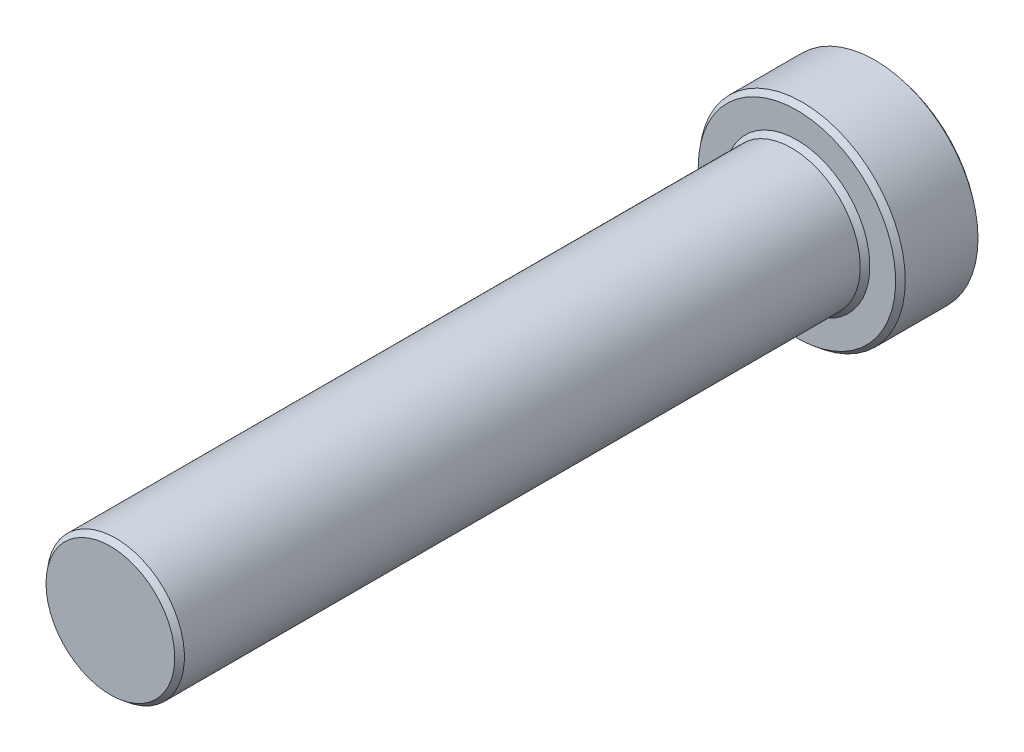
ISO-10303-21;
HEADER;
FILE_DESCRIPTION(('STEP AP214'),'2;1');
FILE_NAME('part.step','',(''),(''),'','','');
FILE_SCHEMA(('AUTOMOTIVE_DESIGN { 1 0 10303 214 1 1 1 1 }'));
ENDSEC;
DATA;
#1=APPLICATION_CONTEXT('core data for automotive mechanical design processes');
#2=APPLICATION_PROTOCOL_DEFINITION('international standard','automotive_design',2000,#1);
#3=PRODUCT_CONTEXT('',#1,'mechanical');
#4=PRODUCT('Part','Part','',(#3));
#5=PRODUCT_RELATED_PRODUCT_CATEGORY('part','',(#4));
#6=PRODUCT_DEFINITION_FORMATION('','',#4);
#7=PRODUCT_DEFINITION_CONTEXT('part definition',#1,'design');
#8=PRODUCT_DEFINITION('design','',#6,#7);
#9=PRODUCT_DEFINITION_SHAPE('','',#8);
#10=(LENGTH_UNIT() NAMED_UNIT(*) SI_UNIT(.MILLI.,.METRE.));
#11=(NAMED_UNIT(*) PLANE_ANGLE_UNIT() SI_UNIT($,.RADIAN.));
#12=(NAMED_UNIT(*) SI_UNIT($,.STERADIAN.) SOLID_ANGLE_UNIT());
#13=UNCERTAINTY_MEASURE_WITH_UNIT(LENGTH_MEASURE(1.E-05),#10,'distance_accuracy_value','');
#14=(GEOMETRIC_REPRESENTATION_CONTEXT(3) GLOBAL_UNCERTAINTY_ASSIGNED_CONTEXT((#13)) GLOBAL_UNIT_ASSIGNED_CONTEXT((#10,
#11,#12)) REPRESENTATION_CONTEXT('',''));
#15=CARTESIAN_POINT('',(0.,0.,0.));
#16=DIRECTION('',(0.,0.,1.));
#17=DIRECTION('',(1.,0.,0.));
#18=AXIS2_PLACEMENT_3D('',#15,#16,#17);
#19=CARTESIAN_POINT('',(0.,0.,-22.0783093017638));
#20=DIRECTION('',(0.,0.,-1.));
#21=DIRECTION('',(-1.,0.,0.));
#22=AXIS2_PLACEMENT_3D('',#19,#20,#21);
#23=CONICAL_SURFACE('',#22,10.6246950475544,0.674740942223556);
#24=CARTESIAN_POINT('',(0.,0.,-21.2974404923208));
#25=DIRECTION('',(0.,0.,-1.));
#26=DIRECTION('',(-1.,0.,0.));
#27=AXIS2_PLACEMENT_3D('',#24,#25,#26);
#28=CIRCLE('',#27,10.);
#29=CARTESIAN_POINT('',(-10.,0.,-21.2974404923208));
#30=VERTEX_POINT('',#29);
#31=EDGE_CURVE('E59',#30,#30,#28,.T.);
#32=ORIENTED_EDGE('',*,*,#31,.T.);
#33=EDGE_LOOP('',(#32));
#34=FACE_BOUND('',#33,.T.);
#35=CARTESIAN_POINT('',(0.,0.,-22.0783093017638));
#36=DIRECTION('',(0.,0.,-1.));
#37=DIRECTION('',(-1.,0.,0.));
#38=AXIS2_PLACEMENT_3D('',#35,#36,#37);
#39=CIRCLE('',#38,10.6246950475544);
#40=CARTESIAN_POINT('',(-10.6246950475544,0.,-22.0783093017638));
#41=VERTEX_POINT('',#40);
#42=EDGE_CURVE('E10',#41,#41,#39,.T.);
#43=ORIENTED_EDGE('',*,*,#42,.F.);
#44=EDGE_LOOP('',(#43));
#45=FACE_BOUND('',#44,.T.);
#46=ADVANCED_FACE('F31',(#34,#45),#23,.T.);
#47=CARTESIAN_POINT('',(-10.6246950475544,0.,-22.0783093017638));
#48=DIRECTION('',(0.,0.,1.));
#49=DIRECTION('',(1.,0.,0.));
#50=AXIS2_PLACEMENT_3D('',#47,#48,#49);
#51=PLANE('',#50);
#52=ORIENTED_EDGE('',*,*,#42,.T.);
#53=EDGE_LOOP('',(#52));
#54=FACE_BOUND('',#53,.T.);
#55=CARTESIAN_POINT('',(0.,0.,-22.0783093017638));
#56=DIRECTION('',(0.,0.,-1.));
#57=DIRECTION('',(-1.,0.,0.));
#58=AXIS2_PLACEMENT_3D('',#55,#56,#57);
#59=CIRCLE('',#58,14.3753049524456);
#60=CARTESIAN_POINT('',(-14.3753049524456,0.,-22.0783093017638));
#61=VERTEX_POINT('',#60);
#62=EDGE_CURVE('E37',#61,#61,#59,.T.);
#63=ORIENTED_EDGE('',*,*,#62,.F.);
#64=EDGE_LOOP('',(#63));
#65=FACE_BOUND('',#64,.T.);
#66=ADVANCED_FACE('F77',(#54,#65),#51,.T.);
#67=CARTESIAN_POINT('',(0.,0.,-22.8591781112069));
#68=DIRECTION('',(0.,0.,-1.));
#69=DIRECTION('',(-1.,0.,0.));
#70=AXIS2_PLACEMENT_3D('',#67,#68,#69);
#71=CONICAL_SURFACE('',#70,15.,0.67474094222355);
#72=ORIENTED_EDGE('',*,*,#62,.T.);
#73=EDGE_LOOP('',(#72));
#74=FACE_BOUND('',#73,.T.);
#75=CARTESIAN_POINT('',(0.,0.,-22.8591781112069));
#76=DIRECTION('',(0.,0.,-1.));
#77=DIRECTION('',(-1.,0.,0.));
#78=AXIS2_PLACEMENT_3D('',#75,#76,#77);
#79=CIRCLE('',#78,15.);
#80=CARTESIAN_POINT('',(-15.,0.,-22.8591781112069));
#81=VERTEX_POINT('',#80);
#82=EDGE_CURVE('E41',#81,#81,#79,.T.);
#83=ORIENTED_EDGE('',*,*,#82,.F.);
#84=EDGE_LOOP('',(#83));
#85=FACE_BOUND('',#84,.T.);
#86=ADVANCED_FACE('F81',(#74,#85),#71,.T.);
#87=CARTESIAN_POINT('',(0.,0.,-35.8446601941748));
#88=DIRECTION('',(0.,0.,-1.));
#89=DIRECTION('',(-1.,0.,0.));
#90=AXIS2_PLACEMENT_3D('',#87,#88,#89);
#91=CYLINDRICAL_SURFACE('',#90,15.);
#92=ORIENTED_EDGE('',*,*,#82,.T.);
#93=EDGE_LOOP('',(#92));
#94=FACE_BOUND('',#93,.T.);
#95=CARTESIAN_POINT('',(0.,0.,-33.4536142542094));
#96=DIRECTION('',(0.,0.,-1.));
#97=DIRECTION('',(-1.,0.,0.));
#98=AXIS2_PLACEMENT_3D('',#95,#96,#97);
#99=CIRCLE('',#98,15.);
#100=CARTESIAN_POINT('',(-15.,0.,-33.4536142542094));
#101=VERTEX_POINT('',#100);
#102=EDGE_CURVE('E45',#101,#101,#99,.T.);
#103=ORIENTED_EDGE('',*,*,#102,.F.);
#104=EDGE_LOOP('',(#103));
#105=FACE_BOUND('',#104,.T.);
#106=ADVANCED_FACE('F85',(#94,#105),#91,.T.);
#107=CARTESIAN_POINT('',(0.,0.,-34.0783093017638));
#108=DIRECTION('',(0.,0.,1.));
#109=DIRECTION('',(1.,0.,0.));
#110=AXIS2_PLACEMENT_3D('',#107,#108,#109);
#111=CONICAL_SURFACE('',#110,14.219131190557,0.896055384571347);
#112=ORIENTED_EDGE('',*,*,#102,.T.);
#113=EDGE_LOOP('',(#112));
#114=FACE_BOUND('',#113,.T.);
#115=CARTESIAN_POINT('',(0.,0.,-34.0783093017638));
#116=DIRECTION('',(0.,0.,-1.));
#117=DIRECTION('',(-1.,0.,0.));
#118=AXIS2_PLACEMENT_3D('',#115,#116,#117);
#119=CIRCLE('',#118,14.219131190557);
#120=CARTESIAN_POINT('',(-14.219131190557,0.,-34.0783093017638));
#121=VERTEX_POINT('',#120);
#122=EDGE_CURVE('E50',#121,#121,#119,.T.);
#123=ORIENTED_EDGE('',*,*,#122,.F.);
#124=EDGE_LOOP('',(#123));
#125=FACE_BOUND('',#124,.T.);
#126=ADVANCED_FACE('F91',(#114,#125),#111,.T.);
#127=CARTESIAN_POINT('',(-14.219131190557,0.,-34.0783093017638));
#128=DIRECTION('',(0.,0.,-1.));
#129=DIRECTION('',(-1.,0.,0.));
#130=AXIS2_PLACEMENT_3D('',#127,#128,#129);
#131=PLANE('',#130);
#132=ORIENTED_EDGE('',*,*,#122,.T.);
#133=EDGE_LOOP('',(#132));
#134=FACE_BOUND('',#133,.T.);
#135=ADVANCED_FACE('F95',(#134),#131,.T.);
#136=CARTESIAN_POINT('',(-9.37530495244557,0.,77.9216906982362));
#137=DIRECTION('',(0.,0.,1.));
#138=DIRECTION('',(1.,0.,0.));
#139=AXIS2_PLACEMENT_3D('',#136,#137,#138);
#140=PLANE('',#139);
#141=CARTESIAN_POINT('',(0.,0.,77.9216906982362));
#142=DIRECTION('',(0.,0.,-1.));
#143=DIRECTION('',(-1.,0.,0.));
#144=AXIS2_PLACEMENT_3D('',#141,#142,#143);
#145=CIRCLE('',#144,9.37530495244557);
#146=CARTESIAN_POINT('',(-9.37530495244557,0.,77.9216906982362));
#147=VERTEX_POINT('',#146);
#148=EDGE_CURVE('E53',#147,#147,#145,.T.);
#149=ORIENTED_EDGE('',*,*,#148,.F.);
#150=EDGE_LOOP('',(#149));
#151=FACE_BOUND('',#150,.T.);
#152=ADVANCED_FACE('F73',(#151),#140,.T.);
#153=CARTESIAN_POINT('',(0.,0.,77.1408218887932));
#154=DIRECTION('',(0.,0.,-1.));
#155=DIRECTION('',(-1.,0.,0.));
#156=AXIS2_PLACEMENT_3D('',#153,#154,#155);
#157=CONICAL_SURFACE('',#156,9.99999999999999,0.674740942223544);
#158=ORIENTED_EDGE('',*,*,#148,.T.);
#159=EDGE_LOOP('',(#158));
#160=FACE_BOUND('',#159,.T.);
#161=CARTESIAN_POINT('',(0.,0.,77.1408218887932));
#162=DIRECTION('',(0.,0.,-1.));
#163=DIRECTION('',(-1.,0.,0.));
#164=AXIS2_PLACEMENT_3D('',#161,#162,#163);
#165=CIRCLE('',#164,9.99999999999999);
#166=CARTESIAN_POINT('',(-9.99999999999999,0.,77.1408218887932));
#167=VERTEX_POINT('',#166);
#168=EDGE_CURVE('E56',#167,#167,#165,.T.);
#169=ORIENTED_EDGE('',*,*,#168,.F.);
#170=EDGE_LOOP('',(#169));
#171=FACE_BOUND('',#170,.T.);
#172=ADVANCED_FACE('F67',(#160,#171),#157,.T.);
#173=CARTESIAN_POINT('',(0.,0.,-35.8446601941748));
#174=DIRECTION('',(0.,0.,-1.));
#175=DIRECTION('',(-1.,0.,0.));
#176=AXIS2_PLACEMENT_3D('',#173,#174,#175);
#177=CYLINDRICAL_SURFACE('',#176,10.);
#178=ORIENTED_EDGE('',*,*,#168,.T.);
#179=EDGE_LOOP('',(#178));
#180=FACE_BOUND('',#179,.T.);
#181=ORIENTED_EDGE('',*,*,#31,.F.);
#182=EDGE_LOOP('',(#181));
#183=FACE_BOUND('',#182,.T.);
#184=ADVANCED_FACE('F65',(#180,#183),#177,.T.);
#185=CLOSED_SHELL('',(#46,#66,#86,#106,#126,#135,#152,#172,#184));
#186=MANIFOLD_SOLID_BREP('B2',#185);
#187=ADVANCED_BREP_SHAPE_REPRESENTATION('',(#18,#186),#14);
#188=SHAPE_DEFINITION_REPRESENTATION(#9,#187);
ENDSEC;
END-ISO-10303-21;
